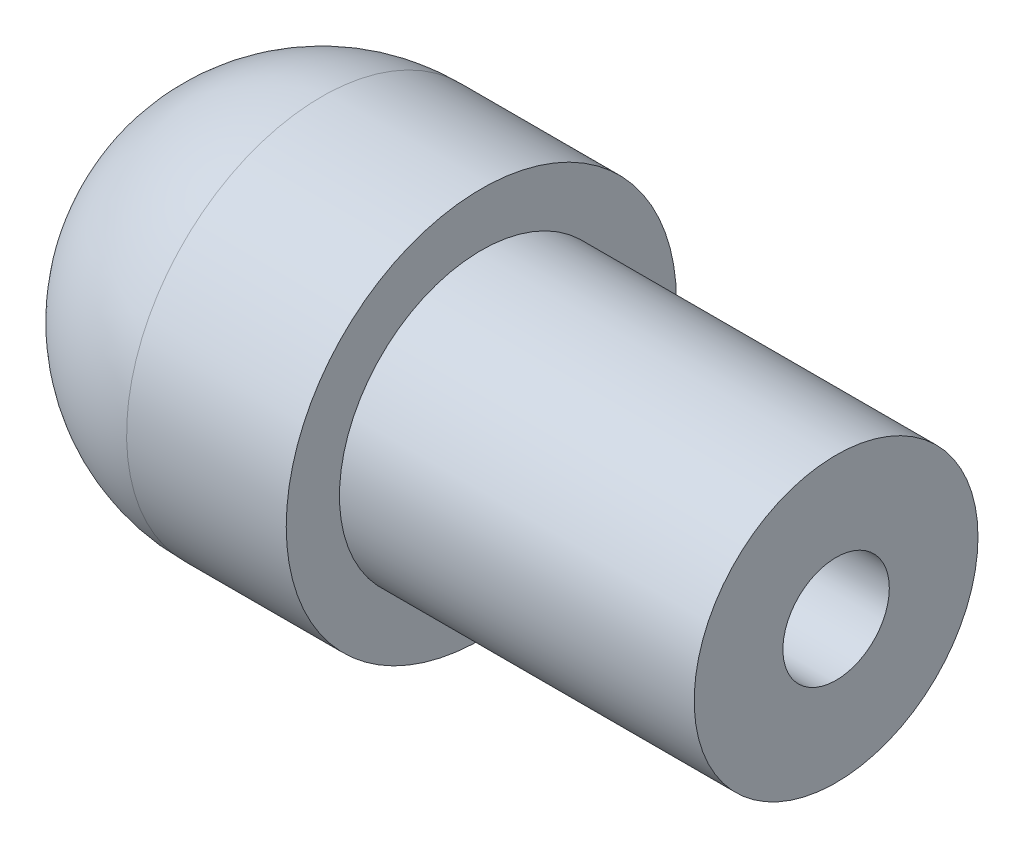
ISO-10303-21;
HEADER;
FILE_DESCRIPTION(('STEP AP214'),'2;1');
FILE_NAME('part.step','',(''),(''),'','','');
FILE_SCHEMA(('AUTOMOTIVE_DESIGN { 1 0 10303 214 1 1 1 1 }'));
ENDSEC;
DATA;
#1=APPLICATION_CONTEXT('core data for automotive mechanical design processes');
#2=APPLICATION_PROTOCOL_DEFINITION('international standard','automotive_design',2000,#1);
#3=PRODUCT_CONTEXT('',#1,'mechanical');
#4=PRODUCT('Part','Part','',(#3));
#5=PRODUCT_RELATED_PRODUCT_CATEGORY('part','',(#4));
#6=PRODUCT_DEFINITION_FORMATION('','',#4);
#7=PRODUCT_DEFINITION_CONTEXT('part definition',#1,'design');
#8=PRODUCT_DEFINITION('design','',#6,#7);
#9=PRODUCT_DEFINITION_SHAPE('','',#8);
#10=(LENGTH_UNIT() NAMED_UNIT(*) SI_UNIT(.MILLI.,.METRE.));
#11=(NAMED_UNIT(*) PLANE_ANGLE_UNIT() SI_UNIT($,.RADIAN.));
#12=(NAMED_UNIT(*) SI_UNIT($,.STERADIAN.) SOLID_ANGLE_UNIT());
#13=UNCERTAINTY_MEASURE_WITH_UNIT(LENGTH_MEASURE(1.E-05),#10,'distance_accuracy_value','');
#14=(GEOMETRIC_REPRESENTATION_CONTEXT(3) GLOBAL_UNCERTAINTY_ASSIGNED_CONTEXT((#13)) GLOBAL_UNIT_ASSIGNED_CONTEXT((#10,
#11,#12)) REPRESENTATION_CONTEXT('',''));
#15=CARTESIAN_POINT('',(0.,0.,0.));
#16=DIRECTION('',(0.,0.,1.));
#17=DIRECTION('',(1.,0.,0.));
#18=AXIS2_PLACEMENT_3D('',#15,#16,#17);
#19=CARTESIAN_POINT('',(20.,4.,0.));
#20=DIRECTION('',(-1.,0.,0.));
#21=DIRECTION('',(0.,0.,1.));
#22=AXIS2_PLACEMENT_3D('',#19,#20,#21);
#23=PLANE('',#22);
#24=CARTESIAN_POINT('',(20.,0.,0.));
#25=DIRECTION('',(1.,0.,0.));
#26=DIRECTION('',(0.,0.,-1.));
#27=AXIS2_PLACEMENT_3D('',#24,#25,#26);
#28=CIRCLE('',#27,1.5);
#29=CARTESIAN_POINT('',(20.,0.,-1.5));
#30=VERTEX_POINT('',#29);
#31=EDGE_CURVE('E65',#30,#30,#28,.T.);
#32=ORIENTED_EDGE('',*,*,#31,.F.);
#33=EDGE_LOOP('',(#32));
#34=FACE_BOUND('',#33,.T.);
#35=CARTESIAN_POINT('',(20.,0.,0.));
#36=DIRECTION('',(1.,0.,0.));
#37=DIRECTION('',(0.,0.,-1.));
#38=AXIS2_PLACEMENT_3D('',#35,#36,#37);
#39=CIRCLE('',#38,4.);
#40=CARTESIAN_POINT('',(20.,0.,-4.));
#41=VERTEX_POINT('',#40);
#42=EDGE_CURVE('E58',#41,#41,#39,.T.);
#43=ORIENTED_EDGE('',*,*,#42,.T.);
#44=EDGE_LOOP('',(#43));
#45=FACE_BOUND('',#44,.T.);
#46=ADVANCED_FACE('F41',(#34,#45),#23,.F.);
#47=CARTESIAN_POINT('',(5.5,0.,0.));
#48=DIRECTION('',(1.,0.,0.));
#49=DIRECTION('',(0.,-1.,0.));
#50=AXIS2_PLACEMENT_3D('',#47,#48,#49);
#51=SPHERICAL_SURFACE('',#50,5.5);
#52=CARTESIAN_POINT('',(5.5,0.,0.));
#53=DIRECTION('',(1.,0.,0.));
#54=DIRECTION('',(0.,0.,-1.));
#55=AXIS2_PLACEMENT_3D('',#52,#53,#54);
#56=CIRCLE('',#55,5.5);
#57=CARTESIAN_POINT('',(5.5,0.,-5.5));
#58=VERTEX_POINT('',#57);
#59=EDGE_CURVE('E10',#58,#58,#56,.T.);
#60=ORIENTED_EDGE('',*,*,#59,.F.);
#61=EDGE_LOOP('',(#60));
#62=FACE_BOUND('',#61,.T.);
#63=ADVANCED_FACE('F84',(#62),#51,.T.);
#64=CARTESIAN_POINT('',(0.,0.,0.));
#65=DIRECTION('',(1.,0.,0.));
#66=DIRECTION('',(0.,0.,-1.));
#67=AXIS2_PLACEMENT_3D('',#64,#65,#66);
#68=CYLINDRICAL_SURFACE('',#67,5.5);
#69=CARTESIAN_POINT('',(10.,0.,0.));
#70=DIRECTION('',(1.,0.,0.));
#71=DIRECTION('',(0.,0.,-1.));
#72=AXIS2_PLACEMENT_3D('',#69,#70,#71);
#73=CIRCLE('',#72,5.5);
#74=CARTESIAN_POINT('',(10.,0.,-5.5));
#75=VERTEX_POINT('',#74);
#76=EDGE_CURVE('E48',#75,#75,#73,.T.);
#77=ORIENTED_EDGE('',*,*,#76,.F.);
#78=EDGE_LOOP('',(#77));
#79=FACE_BOUND('',#78,.T.);
#80=ORIENTED_EDGE('',*,*,#59,.T.);
#81=EDGE_LOOP('',(#80));
#82=FACE_BOUND('',#81,.T.);
#83=ADVANCED_FACE('F94',(#79,#82),#68,.T.);
#84=CARTESIAN_POINT('',(10.,5.5,0.));
#85=DIRECTION('',(-1.,0.,0.));
#86=DIRECTION('',(0.,0.,1.));
#87=AXIS2_PLACEMENT_3D('',#84,#85,#86);
#88=PLANE('',#87);
#89=CARTESIAN_POINT('',(10.,0.,0.));
#90=DIRECTION('',(1.,0.,0.));
#91=DIRECTION('',(0.,0.,-1.));
#92=AXIS2_PLACEMENT_3D('',#89,#90,#91);
#93=CIRCLE('',#92,4.);
#94=CARTESIAN_POINT('',(10.,0.,-4.));
#95=VERTEX_POINT('',#94);
#96=EDGE_CURVE('E53',#95,#95,#93,.T.);
#97=ORIENTED_EDGE('',*,*,#96,.F.);
#98=EDGE_LOOP('',(#97));
#99=FACE_BOUND('',#98,.T.);
#100=ORIENTED_EDGE('',*,*,#76,.T.);
#101=EDGE_LOOP('',(#100));
#102=FACE_BOUND('',#101,.T.);
#103=ADVANCED_FACE('F89',(#99,#102),#88,.F.);
#104=CARTESIAN_POINT('',(0.,0.,0.));
#105=DIRECTION('',(1.,0.,0.));
#106=DIRECTION('',(0.,0.,-1.));
#107=AXIS2_PLACEMENT_3D('',#104,#105,#106);
#108=CYLINDRICAL_SURFACE('',#107,4.);
#109=ORIENTED_EDGE('',*,*,#42,.F.);
#110=EDGE_LOOP('',(#109));
#111=FACE_BOUND('',#110,.T.);
#112=ORIENTED_EDGE('',*,*,#96,.T.);
#113=EDGE_LOOP('',(#112));
#114=FACE_BOUND('',#113,.T.);
#115=ADVANCED_FACE('F78',(#111,#114),#108,.T.);
#116=CARTESIAN_POINT('',(5.5,0.,0.));
#117=DIRECTION('',(1.,0.,0.));
#118=DIRECTION('',(0.,0.,-1.));
#119=AXIS2_PLACEMENT_3D('',#116,#117,#118);
#120=CYLINDRICAL_SURFACE('',#119,1.5);
#121=CARTESIAN_POINT('',(5.5,0.,0.));
#122=DIRECTION('',(1.,0.,0.));
#123=DIRECTION('',(0.,0.,-1.));
#124=AXIS2_PLACEMENT_3D('',#121,#122,#123);
#125=CIRCLE('',#124,1.5);
#126=CARTESIAN_POINT('',(5.5,0.,-1.5));
#127=VERTEX_POINT('',#126);
#128=EDGE_CURVE('E64',#127,#127,#125,.T.);
#129=CARTESIAN_POINT('',(5.5,0.,-1.5));
#130=CARTESIAN_POINT('',(5.65104166666666,0.,-1.5));
#131=CARTESIAN_POINT('',(5.80208333333333,0.,-1.5));
#132=CARTESIAN_POINT('',(6.10416666666666,0.,-1.5));
#133=CARTESIAN_POINT('',(6.25520833333333,0.,-1.5));
#134=CARTESIAN_POINT('',(6.55729166666666,0.,-1.5));
#135=CARTESIAN_POINT('',(6.70833333333333,0.,-1.5));
#136=CARTESIAN_POINT('',(7.01041666666666,0.,-1.5));
#137=CARTESIAN_POINT('',(7.16145833333333,0.,-1.5));
#138=CARTESIAN_POINT('',(7.46354166666666,0.,-1.5));
#139=CARTESIAN_POINT('',(7.61458333333333,0.,-1.5));
#140=CARTESIAN_POINT('',(7.91666666666666,0.,-1.5));
#141=CARTESIAN_POINT('',(8.06770833333333,0.,-1.5));
#142=CARTESIAN_POINT('',(8.36979166666666,0.,-1.5));
#143=CARTESIAN_POINT('',(8.52083333333333,0.,-1.5));
#144=CARTESIAN_POINT('',(8.82291666666666,0.,-1.5));
#145=CARTESIAN_POINT('',(8.97395833333333,0.,-1.5));
#146=CARTESIAN_POINT('',(9.27604166666666,0.,-1.5));
#147=CARTESIAN_POINT('',(9.42708333333333,0.,-1.5));
#148=CARTESIAN_POINT('',(9.72916666666666,0.,-1.5));
#149=CARTESIAN_POINT('',(9.88020833333333,0.,-1.5));
#150=CARTESIAN_POINT('',(10.1822916666667,0.,-1.5));
#151=CARTESIAN_POINT('',(10.3333333333333,0.,-1.5));
#152=CARTESIAN_POINT('',(10.6354166666667,0.,-1.5));
#153=CARTESIAN_POINT('',(10.7864583333333,0.,-1.5));
#154=CARTESIAN_POINT('',(11.0885416666667,0.,-1.5));
#155=CARTESIAN_POINT('',(11.2395833333333,0.,-1.5));
#156=CARTESIAN_POINT('',(11.5416666666667,0.,-1.5));
#157=CARTESIAN_POINT('',(11.6927083333333,0.,-1.5));
#158=CARTESIAN_POINT('',(11.9947916666667,0.,-1.5));
#159=CARTESIAN_POINT('',(12.1458333333333,0.,-1.5));
#160=CARTESIAN_POINT('',(12.4479166666667,0.,-1.5));
#161=CARTESIAN_POINT('',(12.5989583333333,0.,-1.5));
#162=CARTESIAN_POINT('',(12.9010416666667,0.,-1.5));
#163=CARTESIAN_POINT('',(13.0520833333333,0.,-1.5));
#164=CARTESIAN_POINT('',(13.3541666666667,0.,-1.5));
#165=CARTESIAN_POINT('',(13.5052083333333,0.,-1.5));
#166=CARTESIAN_POINT('',(13.8072916666667,0.,-1.5));
#167=CARTESIAN_POINT('',(13.9583333333333,0.,-1.5));
#168=CARTESIAN_POINT('',(14.2604166666667,0.,-1.5));
#169=CARTESIAN_POINT('',(14.4114583333333,0.,-1.5));
#170=CARTESIAN_POINT('',(14.7135416666667,0.,-1.5));
#171=CARTESIAN_POINT('',(14.8645833333333,0.,-1.5));
#172=CARTESIAN_POINT('',(15.1666666666667,0.,-1.5));
#173=CARTESIAN_POINT('',(15.3177083333333,0.,-1.5));
#174=CARTESIAN_POINT('',(15.6197916666667,0.,-1.5));
#175=CARTESIAN_POINT('',(15.7708333333333,0.,-1.5));
#176=CARTESIAN_POINT('',(16.0729166666667,0.,-1.5));
#177=CARTESIAN_POINT('',(16.2239583333333,0.,-1.5));
#178=CARTESIAN_POINT('',(16.5260416666667,0.,-1.5));
#179=CARTESIAN_POINT('',(16.6770833333333,0.,-1.5));
#180=CARTESIAN_POINT('',(16.9791666666667,0.,-1.5));
#181=CARTESIAN_POINT('',(17.1302083333333,0.,-1.5));
#182=CARTESIAN_POINT('',(17.4322916666667,0.,-1.5));
#183=CARTESIAN_POINT('',(17.5833333333333,0.,-1.5));
#184=CARTESIAN_POINT('',(17.8854166666667,0.,-1.5));
#185=CARTESIAN_POINT('',(18.0364583333333,0.,-1.5));
#186=CARTESIAN_POINT('',(18.3385416666667,0.,-1.5));
#187=CARTESIAN_POINT('',(18.4895833333333,0.,-1.5));
#188=CARTESIAN_POINT('',(18.7916666666667,0.,-1.5));
#189=CARTESIAN_POINT('',(18.9427083333333,0.,-1.5));
#190=CARTESIAN_POINT('',(19.2447916666667,0.,-1.5));
#191=CARTESIAN_POINT('',(19.3958333333333,0.,-1.5));
#192=CARTESIAN_POINT('',(19.6979166666667,0.,-1.5));
#193=CARTESIAN_POINT('',(19.8489583333333,0.,-1.5));
#194=CARTESIAN_POINT('',(20.,0.,-1.5));
#195=B_SPLINE_CURVE_WITH_KNOTS('',3,(#129,#130,#131,#132,#133,#134,#135,#136,#137,#138,#139,
#140,#141,#142,#143,#144,#145,#146,#147,#148,#149,#150,#151,#152,#153,#154,#155,#156,#157,#158,
#159,#160,#161,#162,#163,#164,#165,#166,#167,#168,#169,#170,#171,#172,#173,#174,#175,#176,#177,
#178,#179,#180,#181,#182,#183,#184,#185,#186,#187,#188,#189,#190,#191,#192,#193,#194),
.UNSPECIFIED.,.F.,.F.,(4,2,2,2,2,2,2,2,2,2,2,2,2,2,2,2,2,2,2,2,2,2,2,2,2,2,2,2,2,2,2,2,4),(0.,
0.453125,0.90625,1.359375,1.8125,2.265625,2.71875,3.171875,3.625,4.078125,4.53125,4.984375,
5.4375,5.890625,6.34375,6.796875,7.25,7.703125,8.15625,8.609375,9.0625,9.515625,9.96875,
10.421875,10.875,11.328125,11.78125,12.234375,12.6875,13.140625,13.59375,14.046875,14.5),.UNSPECIFIED.);
#196=EDGE_CURVE('BSEAM75',#127,#30,#195,.T.);
#197=ORIENTED_EDGE('',*,*,#128,.F.);
#198=ORIENTED_EDGE('',*,*,#31,.T.);
#199=ORIENTED_EDGE('',*,*,#196,.T.);
#200=ORIENTED_EDGE('',*,*,#196,.F.);
#201=EDGE_LOOP('',(#197,#199,#198,#200));
#202=FACE_BOUND('',#201,.T.);
#203=ADVANCED_FACE('F75',(#202),#120,.F.);
#204=CARTESIAN_POINT('',(5.5,0.,0.));
#205=DIRECTION('',(1.,0.,0.));
#206=DIRECTION('',(0.,0.,-1.));
#207=AXIS2_PLACEMENT_3D('',#204,#205,#206);
#208=PLANE('',#207);
#209=ORIENTED_EDGE('',*,*,#128,.T.);
#210=EDGE_LOOP('',(#209));
#211=FACE_BOUND('',#210,.T.);
#212=ADVANCED_FACE('F73',(#211),#208,.T.);
#213=CLOSED_SHELL('',(#46,#63,#83,#103,#115,#203,#212));
#214=MANIFOLD_SOLID_BREP('B2',#213);
#215=ADVANCED_BREP_SHAPE_REPRESENTATION('',(#18,#214),#14);
#216=SHAPE_DEFINITION_REPRESENTATION(#9,#215);
ENDSEC;
END-ISO-10303-21;
